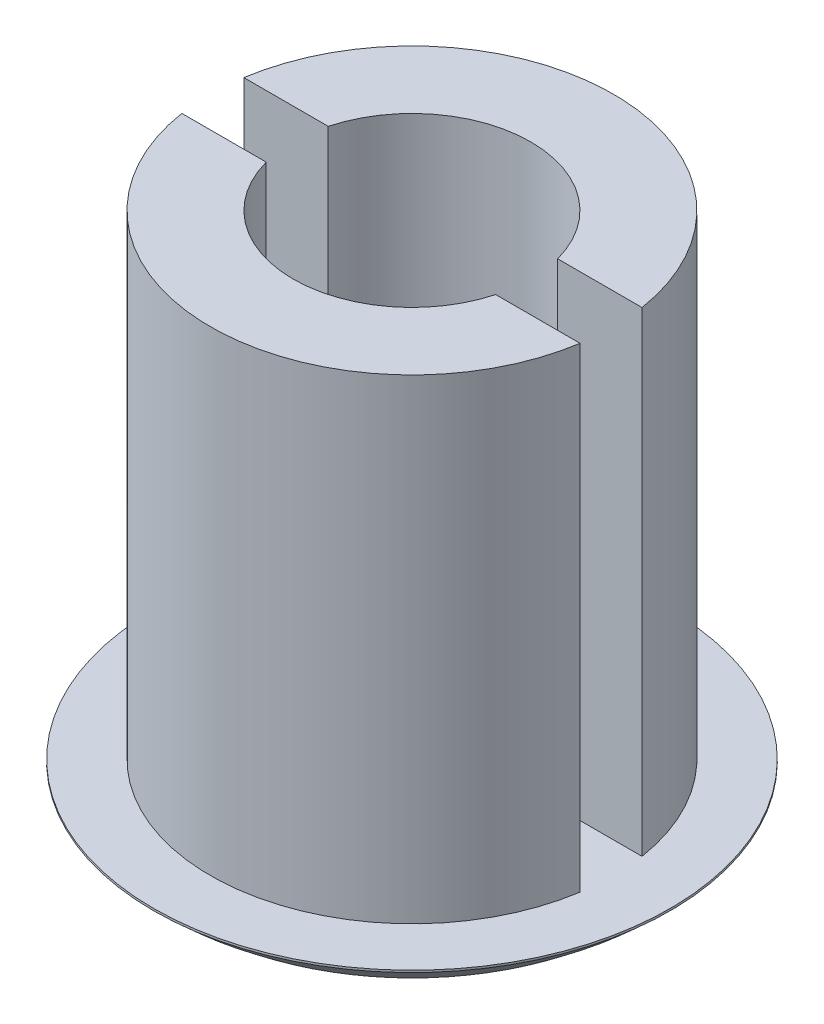
ISO-10303-21;
HEADER;
FILE_DESCRIPTION(('STEP AP214'),'2;1');
FILE_NAME('part.step','',(''),(''),'','','');
FILE_SCHEMA(('AUTOMOTIVE_DESIGN { 1 0 10303 214 1 1 1 1 }'));
ENDSEC;
DATA;
#1=APPLICATION_CONTEXT('core data for automotive mechanical design processes');
#2=APPLICATION_PROTOCOL_DEFINITION('international standard','automotive_design',2000,#1);
#3=PRODUCT_CONTEXT('',#1,'mechanical');
#4=PRODUCT('Part','Part','',(#3));
#5=PRODUCT_RELATED_PRODUCT_CATEGORY('part','',(#4));
#6=PRODUCT_DEFINITION_FORMATION('','',#4);
#7=PRODUCT_DEFINITION_CONTEXT('part definition',#1,'design');
#8=PRODUCT_DEFINITION('design','',#6,#7);
#9=PRODUCT_DEFINITION_SHAPE('','',#8);
#10=(LENGTH_UNIT() NAMED_UNIT(*) SI_UNIT(.MILLI.,.METRE.));
#11=(NAMED_UNIT(*) PLANE_ANGLE_UNIT() SI_UNIT($,.RADIAN.));
#12=(NAMED_UNIT(*) SI_UNIT($,.STERADIAN.) SOLID_ANGLE_UNIT());
#13=UNCERTAINTY_MEASURE_WITH_UNIT(LENGTH_MEASURE(1.E-05),#10,'distance_accuracy_value','');
#14=(GEOMETRIC_REPRESENTATION_CONTEXT(3) GLOBAL_UNCERTAINTY_ASSIGNED_CONTEXT((#13)) GLOBAL_UNIT_ASSIGNED_CONTEXT((#10,
#11,#12)) REPRESENTATION_CONTEXT('',''));
#15=CARTESIAN_POINT('',(0.,0.,0.));
#16=DIRECTION('',(0.,0.,1.));
#17=DIRECTION('',(1.,0.,0.));
#18=AXIS2_PLACEMENT_3D('',#15,#16,#17);
#19=CARTESIAN_POINT('',(0.,23.1,0.));
#20=DIRECTION('',(0.,-1.,0.));
#21=DIRECTION('',(0.,0.,-1.));
#22=AXIS2_PLACEMENT_3D('',#19,#20,#21);
#23=CYLINDRICAL_SURFACE('',#22,9.75);
#24=CARTESIAN_POINT('',(0.,23.1,0.));
#25=DIRECTION('',(0.,1.,0.));
#26=DIRECTION('',(0.,0.,1.));
#27=AXIS2_PLACEMENT_3D('',#24,#25,#26);
#28=CIRCLE('',#27,9.75);
#29=CARTESIAN_POINT('',(9.63392443399885,23.1,-1.5));
#30=VERTEX_POINT('',#29);
#31=CARTESIAN_POINT('',(-9.63392443399885,23.1,-1.5));
#32=VERTEX_POINT('',#31);
#33=EDGE_CURVE('E135',#30,#32,#28,.T.);
#34=ORIENTED_EDGE('',*,*,#33,.F.);
#35=DIRECTION('',(0.,-1.,0.));
#36=VECTOR('',#35,1.);
#37=CARTESIAN_POINT('',(9.63392443399885,23.1,-1.5));
#38=LINE('',#37,#36);
#39=CARTESIAN_POINT('',(9.63392443399885,0.0999999999999994,-1.5));
#40=VERTEX_POINT('',#39);
#41=EDGE_CURVE('E196',#30,#40,#38,.T.);
#42=ORIENTED_EDGE('',*,*,#41,.T.);
#43=CARTESIAN_POINT('',(0.,0.1,0.));
#44=DIRECTION('',(0.,1.,0.));
#45=DIRECTION('',(0.,0.,1.));
#46=AXIS2_PLACEMENT_3D('',#43,#44,#45);
#47=CIRCLE('',#46,9.75);
#48=CARTESIAN_POINT('',(-9.63392443399885,0.0999999999999994,-1.5));
#49=VERTEX_POINT('',#48);
#50=EDGE_CURVE('E147',#40,#49,#47,.T.);
#51=ORIENTED_EDGE('',*,*,#50,.T.);
#52=DIRECTION('',(0.,-1.,0.));
#53=VECTOR('',#52,1.);
#54=CARTESIAN_POINT('',(-9.63392443399885,23.1,-1.5));
#55=LINE('',#54,#53);
#56=EDGE_CURVE('E183',#49,#32,#55,.F.);
#57=ORIENTED_EDGE('',*,*,#56,.T.);
#58=EDGE_LOOP('',(#34,#42,#51,#57));
#59=FACE_BOUND('',#58,.T.);
#60=ADVANCED_FACE('F35',(#59),#23,.T.);
#61=CARTESIAN_POINT('',(0.,23.1,0.));
#62=DIRECTION('',(0.,1.,0.));
#63=DIRECTION('',(0.,0.,1.));
#64=AXIS2_PLACEMENT_3D('',#61,#62,#63);
#65=PLANE('',#64);
#66=DIRECTION('',(-1.,0.,0.));
#67=VECTOR('',#66,1.);
#68=CARTESIAN_POINT('',(-10.6401202428384,23.1,-1.5));
#69=LINE('',#68,#67);
#70=CARTESIAN_POINT('',(5.55090082779363,23.1,-1.5));
#71=VERTEX_POINT('',#70);
#72=EDGE_CURVE('E188',#30,#71,#69,.T.);
#73=ORIENTED_EDGE('',*,*,#72,.F.);
#74=ORIENTED_EDGE('',*,*,#33,.T.);
#75=CARTESIAN_POINT('',(-5.55090082779363,23.1,-1.5));
#76=VERTEX_POINT('',#75);
#77=EDGE_CURVE('E130',#76,#32,#69,.T.);
#78=ORIENTED_EDGE('',*,*,#77,.F.);
#79=CARTESIAN_POINT('',(0.,23.1,0.));
#80=DIRECTION('',(0.,1.,0.));
#81=DIRECTION('',(0.,0.,1.));
#82=AXIS2_PLACEMENT_3D('',#79,#80,#81);
#83=CIRCLE('',#82,5.75);
#84=EDGE_CURVE('E198',#71,#76,#83,.T.);
#85=ORIENTED_EDGE('',*,*,#84,.F.);
#86=EDGE_LOOP('',(#73,#74,#78,#85));
#87=FACE_BOUND('',#86,.T.);
#88=ADVANCED_FACE('F218',(#87),#65,.T.);
#89=CARTESIAN_POINT('',(0.,23.1,0.));
#90=DIRECTION('',(0.,-1.,0.));
#91=DIRECTION('',(0.,0.,-1.));
#92=AXIS2_PLACEMENT_3D('',#89,#90,#91);
#93=CYLINDRICAL_SURFACE('',#92,5.75);
#94=DIRECTION('',(0.,-1.,0.));
#95=VECTOR('',#94,1.);
#96=CARTESIAN_POINT('',(5.55090082779363,23.1,-1.5));
#97=LINE('',#96,#95);
#98=CARTESIAN_POINT('',(5.55090082779363,0.223328596650741,-1.5));
#99=VERTEX_POINT('',#98);
#100=EDGE_CURVE('E158',#71,#99,#97,.T.);
#101=ORIENTED_EDGE('',*,*,#100,.F.);
#102=ORIENTED_EDGE('',*,*,#84,.T.);
#103=DIRECTION('',(0.,-1.,0.));
#104=VECTOR('',#103,1.);
#105=CARTESIAN_POINT('',(-5.55090082779363,23.1,-1.5));
#106=LINE('',#105,#104);
#107=CARTESIAN_POINT('',(-5.55090082779363,0.223328596650741,-1.5));
#108=VERTEX_POINT('',#107);
#109=EDGE_CURVE('E157',#108,#76,#106,.F.);
#110=ORIENTED_EDGE('',*,*,#109,.F.);
#111=CARTESIAN_POINT('',(0.,0.223328596650741,0.));
#112=DIRECTION('',(0.,1.,0.));
#113=DIRECTION('',(0.,0.,1.));
#114=AXIS2_PLACEMENT_3D('',#111,#112,#113);
#115=CIRCLE('',#114,5.75);
#116=EDGE_CURVE('E136',#108,#99,#115,.F.);
#117=ORIENTED_EDGE('',*,*,#116,.T.);
#118=EDGE_LOOP('',(#101,#102,#110,#117));
#119=FACE_BOUND('',#118,.T.);
#120=ADVANCED_FACE('F224',(#119),#93,.F.);
#121=CARTESIAN_POINT('',(0.,0.1,0.));
#122=DIRECTION('',(0.,-1.,0.));
#123=DIRECTION('',(0.,0.,-1.));
#124=AXIS2_PLACEMENT_3D('',#121,#122,#123);
#125=CYLINDRICAL_SURFACE('',#124,12.5);
#126=CARTESIAN_POINT('',(0.,0.1,0.));
#127=DIRECTION('',(0.,1.,0.));
#128=DIRECTION('',(0.,0.,1.));
#129=AXIS2_PLACEMENT_3D('',#126,#127,#128);
#130=CIRCLE('',#129,12.5);
#131=CARTESIAN_POINT('',(0.,0.1,12.5));
#132=VERTEX_POINT('',#131);
#133=EDGE_CURVE('E148',#132,#132,#130,.T.);
#134=ORIENTED_EDGE('',*,*,#133,.F.);
#135=EDGE_LOOP('',(#134));
#136=FACE_BOUND('',#135,.T.);
#137=CARTESIAN_POINT('',(0.,0.,0.));
#138=DIRECTION('',(0.,1.,0.));
#139=DIRECTION('',(0.,0.,1.));
#140=AXIS2_PLACEMENT_3D('',#137,#138,#139);
#141=CIRCLE('',#140,12.5);
#142=CARTESIAN_POINT('',(0.,0.,12.5));
#143=VERTEX_POINT('',#142);
#144=EDGE_CURVE('E139',#143,#143,#141,.T.);
#145=ORIENTED_EDGE('',*,*,#144,.T.);
#146=EDGE_LOOP('',(#145));
#147=FACE_BOUND('',#146,.T.);
#148=ADVANCED_FACE('F238',(#136,#147),#125,.T.);
#149=CARTESIAN_POINT('',(0.,0.1,0.));
#150=DIRECTION('',(0.,1.,0.));
#151=DIRECTION('',(0.,0.,1.));
#152=AXIS2_PLACEMENT_3D('',#149,#150,#151);
#153=PLANE('',#152);
#154=ORIENTED_EDGE('',*,*,#50,.F.);
#155=DIRECTION('',(1.,0.,0.));
#156=VECTOR('',#155,1.);
#157=CARTESIAN_POINT('',(-10.6401202428384,0.0999999999999994,-1.5));
#158=LINE('',#157,#156);
#159=CARTESIAN_POINT('',(5.2549976213125,0.0999999999999994,-1.5));
#160=VERTEX_POINT('',#159);
#161=EDGE_CURVE('E184',#160,#40,#158,.T.);
#162=ORIENTED_EDGE('',*,*,#161,.F.);
#163=CARTESIAN_POINT('',(0.,0.0999999999999994,0.));
#164=DIRECTION('',(0.,1.,0.));
#165=DIRECTION('',(0.,0.,1.));
#166=AXIS2_PLACEMENT_3D('',#163,#164,#165);
#167=CIRCLE('',#166,5.46488792199804);
#168=CARTESIAN_POINT('',(5.2549976213125,0.0999999999999994,1.5));
#169=VERTEX_POINT('',#168);
#170=EDGE_CURVE('E11',#169,#160,#167,.T.);
#171=ORIENTED_EDGE('',*,*,#170,.F.);
#172=DIRECTION('',(-1.,0.,0.));
#173=VECTOR('',#172,1.);
#174=CARTESIAN_POINT('',(-10.6401202428384,0.0999999999999994,1.5));
#175=LINE('',#174,#173);
#176=CARTESIAN_POINT('',(9.63392443399885,0.0999999999999994,1.5));
#177=VERTEX_POINT('',#176);
#178=EDGE_CURVE('E186',#177,#169,#175,.T.);
#179=ORIENTED_EDGE('',*,*,#178,.F.);
#180=CARTESIAN_POINT('',(-9.63392443399885,0.0999999999999994,1.5));
#181=VERTEX_POINT('',#180);
#182=EDGE_CURVE('E145',#181,#177,#47,.T.);
#183=ORIENTED_EDGE('',*,*,#182,.F.);
#184=CARTESIAN_POINT('',(-5.2549976213125,0.0999999999999994,1.5));
#185=VERTEX_POINT('',#184);
#186=EDGE_CURVE('E114',#185,#181,#175,.T.);
#187=ORIENTED_EDGE('',*,*,#186,.F.);
#188=CARTESIAN_POINT('',(-5.2549976213125,0.0999999999999994,-1.5));
#189=VERTEX_POINT('',#188);
#190=EDGE_CURVE('E39',#189,#185,#167,.T.);
#191=ORIENTED_EDGE('',*,*,#190,.F.);
#192=EDGE_CURVE('E177',#49,#189,#158,.T.);
#193=ORIENTED_EDGE('',*,*,#192,.F.);
#194=EDGE_LOOP('',(#154,#162,#171,#179,#183,#187,#191,#193));
#195=FACE_BOUND('',#194,.T.);
#196=ORIENTED_EDGE('',*,*,#133,.T.);
#197=EDGE_LOOP('',(#196));
#198=FACE_BOUND('',#197,.T.);
#199=ADVANCED_FACE('F175',(#195,#198),#153,.T.);
#200=CARTESIAN_POINT('',(0.,13.125,0.));
#201=DIRECTION('',(0.,0.,1.));
#202=DIRECTION('',(1.,0.,0.));
#203=AXIS2_PLACEMENT_3D('',#200,#201,#202);
#204=SPHERICAL_SURFACE('',#203,18.125);
#205=CARTESIAN_POINT('',(0.,13.125,0.));
#206=DIRECTION('',(0.,1.,0.));
#207=DIRECTION('',(0.,0.,1.));
#208=AXIS2_PLACEMENT_3D('',#205,#206,#207);
#209=SPHERICAL_SURFACE('',#208,18.125);
#210=ORIENTED_EDGE('',*,*,#144,.F.);
#211=EDGE_LOOP('',(#210));
#212=FACE_BOUND('',#211,.T.);
#213=ADVANCED_FACE('F37',(#212),#209,.T.);
#214=CARTESIAN_POINT('',(-9.63392443399885,23.1,1.5));
#215=VERTEX_POINT('',#214);
#216=CARTESIAN_POINT('',(9.63392443399885,23.1,1.5));
#217=VERTEX_POINT('',#216);
#218=EDGE_CURVE('E127',#215,#217,#28,.T.);
#219=ORIENTED_EDGE('',*,*,#218,.F.);
#220=DIRECTION('',(0.,-1.,0.));
#221=VECTOR('',#220,1.);
#222=CARTESIAN_POINT('',(-9.63392443399885,23.1,1.5));
#223=LINE('',#222,#221);
#224=EDGE_CURVE('E111',#215,#181,#223,.T.);
#225=ORIENTED_EDGE('',*,*,#224,.T.);
#226=ORIENTED_EDGE('',*,*,#182,.T.);
#227=DIRECTION('',(0.,-1.,0.));
#228=VECTOR('',#227,1.);
#229=CARTESIAN_POINT('',(9.63392443399885,23.1,1.5));
#230=LINE('',#229,#228);
#231=EDGE_CURVE('E120',#177,#217,#230,.F.);
#232=ORIENTED_EDGE('',*,*,#231,.T.);
#233=EDGE_LOOP('',(#219,#225,#226,#232));
#234=FACE_BOUND('',#233,.T.);
#235=ADVANCED_FACE('F134',(#234),#23,.T.);
#236=DIRECTION('',(1.,0.,0.));
#237=VECTOR('',#236,1.);
#238=CARTESIAN_POINT('',(-10.6401202428384,23.1,1.5));
#239=LINE('',#238,#237);
#240=CARTESIAN_POINT('',(-5.55090082779363,23.1,1.5));
#241=VERTEX_POINT('',#240);
#242=EDGE_CURVE('E50',#215,#241,#239,.T.);
#243=ORIENTED_EDGE('',*,*,#242,.F.);
#244=ORIENTED_EDGE('',*,*,#218,.T.);
#245=CARTESIAN_POINT('',(5.55090082779363,23.1,1.5));
#246=VERTEX_POINT('',#245);
#247=EDGE_CURVE('E131',#246,#217,#239,.T.);
#248=ORIENTED_EDGE('',*,*,#247,.F.);
#249=EDGE_CURVE('E129',#241,#246,#83,.T.);
#250=ORIENTED_EDGE('',*,*,#249,.F.);
#251=EDGE_LOOP('',(#243,#244,#248,#250));
#252=FACE_BOUND('',#251,.T.);
#253=ADVANCED_FACE('F125',(#252),#65,.T.);
#254=CARTESIAN_POINT('',(0.,13.125,0.));
#255=DIRECTION('',(0.,0.,1.));
#256=DIRECTION('',(1.,0.,0.));
#257=AXIS2_PLACEMENT_3D('',#254,#255,#256);
#258=SPHERICAL_SURFACE('',#257,14.125);
#259=CARTESIAN_POINT('',(0.,13.125,-1.5));
#260=DIRECTION('',(0.,0.,-1.));
#261=DIRECTION('',(-1.,0.,0.));
#262=AXIS2_PLACEMENT_3D('',#259,#260,#261);
#263=CIRCLE('',#262,14.0451281589026);
#264=EDGE_CURVE('E194',#99,#160,#263,.T.);
#265=ORIENTED_EDGE('',*,*,#264,.F.);
#266=ORIENTED_EDGE('',*,*,#116,.F.);
#267=EDGE_CURVE('E119',#189,#108,#263,.T.);
#268=ORIENTED_EDGE('',*,*,#267,.F.);
#269=ORIENTED_EDGE('',*,*,#190,.T.);
#270=CARTESIAN_POINT('',(0.,13.125,1.5));
#271=DIRECTION('',(0.,0.,1.));
#272=DIRECTION('',(1.,0.,0.));
#273=AXIS2_PLACEMENT_3D('',#270,#271,#272);
#274=CIRCLE('',#273,14.0451281589026);
#275=CARTESIAN_POINT('',(-5.55090082779363,0.223328596650741,1.5));
#276=VERTEX_POINT('',#275);
#277=EDGE_CURVE('E168',#276,#185,#274,.T.);
#278=ORIENTED_EDGE('',*,*,#277,.F.);
#279=CARTESIAN_POINT('',(5.55090082779363,0.223328596650741,1.5));
#280=VERTEX_POINT('',#279);
#281=EDGE_CURVE('E141',#280,#276,#115,.F.);
#282=ORIENTED_EDGE('',*,*,#281,.F.);
#283=EDGE_CURVE('E58',#169,#280,#274,.T.);
#284=ORIENTED_EDGE('',*,*,#283,.F.);
#285=ORIENTED_EDGE('',*,*,#170,.T.);
#286=EDGE_LOOP('',(#265,#266,#268,#269,#278,#282,#284,#285));
#287=FACE_BOUND('',#286,.T.);
#288=ADVANCED_FACE('F166',(#287),#258,.F.);
#289=DIRECTION('',(0.,-1.,0.));
#290=VECTOR('',#289,1.);
#291=CARTESIAN_POINT('',(-5.55090082779363,23.1,1.5));
#292=LINE('',#291,#290);
#293=EDGE_CURVE('E155',#241,#276,#292,.T.);
#294=ORIENTED_EDGE('',*,*,#293,.F.);
#295=ORIENTED_EDGE('',*,*,#249,.T.);
#296=DIRECTION('',(0.,-1.,0.));
#297=VECTOR('',#296,1.);
#298=CARTESIAN_POINT('',(5.55090082779363,23.1,1.5));
#299=LINE('',#298,#297);
#300=EDGE_CURVE('E153',#280,#246,#299,.F.);
#301=ORIENTED_EDGE('',*,*,#300,.F.);
#302=ORIENTED_EDGE('',*,*,#281,.T.);
#303=EDGE_LOOP('',(#294,#295,#301,#302));
#304=FACE_BOUND('',#303,.T.);
#305=ADVANCED_FACE('F203',(#304),#93,.F.);
#306=CARTESIAN_POINT('',(-10.6401202428384,-22.4946254020509,-1.5));
#307=DIRECTION('',(0.,0.,-1.));
#308=DIRECTION('',(-1.,0.,0.));
#309=AXIS2_PLACEMENT_3D('',#306,#307,#308);
#310=PLANE('',#309);
#311=ORIENTED_EDGE('',*,*,#72,.T.);
#312=ORIENTED_EDGE('',*,*,#100,.T.);
#313=ORIENTED_EDGE('',*,*,#264,.T.);
#314=ORIENTED_EDGE('',*,*,#161,.T.);
#315=ORIENTED_EDGE('',*,*,#41,.F.);
#316=EDGE_LOOP('',(#311,#312,#313,#314,#315));
#317=FACE_BOUND('',#316,.T.);
#318=ADVANCED_FACE('F208',(#317),#310,.F.);
#319=CARTESIAN_POINT('',(-10.6401202428384,-22.4946254020509,1.5));
#320=DIRECTION('',(0.,0.,1.));
#321=DIRECTION('',(1.,0.,0.));
#322=AXIS2_PLACEMENT_3D('',#319,#320,#321);
#323=PLANE('',#322);
#324=ORIENTED_EDGE('',*,*,#178,.T.);
#325=ORIENTED_EDGE('',*,*,#283,.T.);
#326=ORIENTED_EDGE('',*,*,#300,.T.);
#327=ORIENTED_EDGE('',*,*,#247,.T.);
#328=ORIENTED_EDGE('',*,*,#231,.F.);
#329=EDGE_LOOP('',(#324,#325,#326,#327,#328));
#330=FACE_BOUND('',#329,.T.);
#331=ADVANCED_FACE('F206',(#330),#323,.F.);
#332=ORIENTED_EDGE('',*,*,#192,.T.);
#333=ORIENTED_EDGE('',*,*,#267,.T.);
#334=ORIENTED_EDGE('',*,*,#109,.T.);
#335=ORIENTED_EDGE('',*,*,#77,.T.);
#336=ORIENTED_EDGE('',*,*,#56,.F.);
#337=EDGE_LOOP('',(#332,#333,#334,#335,#336));
#338=FACE_BOUND('',#337,.T.);
#339=ADVANCED_FACE('F180',(#338),#310,.F.);
#340=ORIENTED_EDGE('',*,*,#242,.T.);
#341=ORIENTED_EDGE('',*,*,#293,.T.);
#342=ORIENTED_EDGE('',*,*,#277,.T.);
#343=ORIENTED_EDGE('',*,*,#186,.T.);
#344=ORIENTED_EDGE('',*,*,#224,.F.);
#345=EDGE_LOOP('',(#340,#341,#342,#343,#344));
#346=FACE_BOUND('',#345,.T.);
#347=ADVANCED_FACE('F112',(#346),#323,.F.);
#348=CLOSED_SHELL('',(#60,#88,#120,#148,#199,#213,#235,#253,#288,#305,#318,#331,#339,#347));
#349=MANIFOLD_SOLID_BREP('B2',#348);
#350=ADVANCED_BREP_SHAPE_REPRESENTATION('',(#18,#349),#14);
#351=SHAPE_DEFINITION_REPRESENTATION(#9,#350);
ENDSEC;
END-ISO-10303-21;
